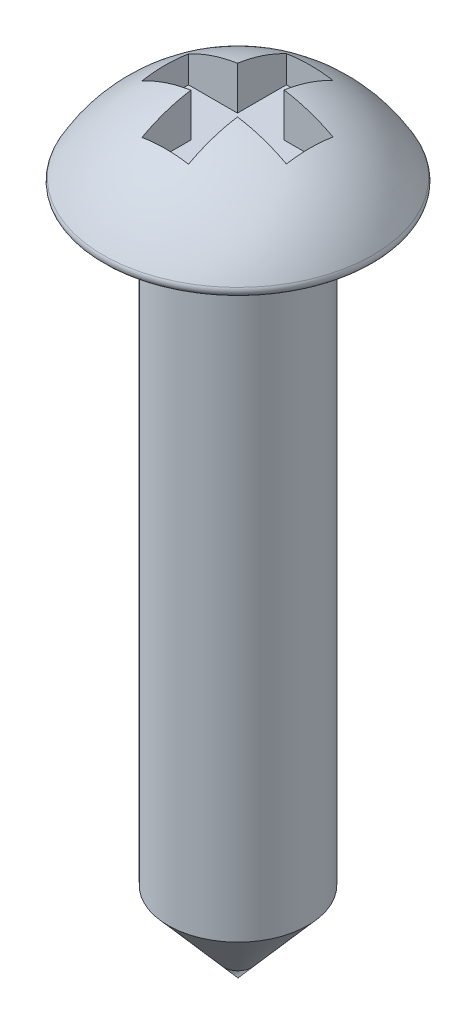
ISO-10303-21;
HEADER;
FILE_DESCRIPTION(('STEP AP214'),'2;1');
FILE_NAME('part.step','',(''),(''),'','','');
FILE_SCHEMA(('AUTOMOTIVE_DESIGN { 1 0 10303 214 1 1 1 1 }'));
ENDSEC;
DATA;
#1=APPLICATION_CONTEXT('core data for automotive mechanical design processes');
#2=APPLICATION_PROTOCOL_DEFINITION('international standard','automotive_design',2000,#1);
#3=PRODUCT_CONTEXT('',#1,'mechanical');
#4=PRODUCT('Part','Part','',(#3));
#5=PRODUCT_RELATED_PRODUCT_CATEGORY('part','',(#4));
#6=PRODUCT_DEFINITION_FORMATION('','',#4);
#7=PRODUCT_DEFINITION_CONTEXT('part definition',#1,'design');
#8=PRODUCT_DEFINITION('design','',#6,#7);
#9=PRODUCT_DEFINITION_SHAPE('','',#8);
#10=(LENGTH_UNIT() NAMED_UNIT(*) SI_UNIT(.MILLI.,.METRE.));
#11=(NAMED_UNIT(*) PLANE_ANGLE_UNIT() SI_UNIT($,.RADIAN.));
#12=(NAMED_UNIT(*) SI_UNIT($,.STERADIAN.) SOLID_ANGLE_UNIT());
#13=UNCERTAINTY_MEASURE_WITH_UNIT(LENGTH_MEASURE(1.E-05),#10,'distance_accuracy_value','');
#14=(GEOMETRIC_REPRESENTATION_CONTEXT(3) GLOBAL_UNCERTAINTY_ASSIGNED_CONTEXT((#13)) GLOBAL_UNIT_ASSIGNED_CONTEXT((#10,
#11,#12)) REPRESENTATION_CONTEXT('',''));
#15=CARTESIAN_POINT('',(0.,0.,0.));
#16=DIRECTION('',(0.,0.,1.));
#17=DIRECTION('',(1.,0.,0.));
#18=AXIS2_PLACEMENT_3D('',#15,#16,#17);
#19=CARTESIAN_POINT('',(0.,-10.7655291922982,0.));
#20=DIRECTION('',(0.,1.,0.));
#21=DIRECTION('',(-1.,0.,0.));
#22=AXIS2_PLACEMENT_3D('',#19,#20,#21);
#23=CONICAL_SURFACE('',#22,0.,0.715536498461953);
#24=CARTESIAN_POINT('',(0.,-9.5,0.));
#25=DIRECTION('',(0.,1.,0.));
#26=DIRECTION('',(-1.,0.,0.));
#27=AXIS2_PLACEMENT_3D('',#24,#25,#26);
#28=CIRCLE('',#27,1.1);
#29=CARTESIAN_POINT('',(-1.1,-9.5,0.));
#30=VERTEX_POINT('',#29);
#31=EDGE_CURVE('E201',#30,#30,#28,.T.);
#32=ORIENTED_EDGE('',*,*,#31,.F.);
#33=EDGE_LOOP('',(#32));
#34=FACE_BOUND('',#33,.T.);
#35=CARTESIAN_POINT('',(0.,-10.7655291922982,0.));
#36=VERTEX_POINT('',#35);
#37=VERTEX_LOOP('',#36);
#38=FACE_BOUND('',#37,.T.);
#39=ADVANCED_FACE('F32',(#34,#38),#23,.T.);
#40=CARTESIAN_POINT('',(0.,3.8000547936802,0.));
#41=DIRECTION('',(0.,1.,0.));
#42=DIRECTION('',(-1.,0.,0.));
#43=AXIS2_PLACEMENT_3D('',#40,#41,#42);
#44=CYLINDRICAL_SURFACE('',#43,1.1);
#45=CARTESIAN_POINT('',(0.,0.,0.));
#46=DIRECTION('',(0.,1.,0.));
#47=DIRECTION('',(-1.,0.,0.));
#48=AXIS2_PLACEMENT_3D('',#45,#46,#47);
#49=CIRCLE('',#48,1.1);
#50=CARTESIAN_POINT('',(-1.1,0.,0.));
#51=VERTEX_POINT('',#50);
#52=EDGE_CURVE('E170',#51,#51,#49,.T.);
#53=ORIENTED_EDGE('',*,*,#52,.F.);
#54=EDGE_LOOP('',(#53));
#55=FACE_BOUND('',#54,.T.);
#56=ORIENTED_EDGE('',*,*,#31,.T.);
#57=EDGE_LOOP('',(#56));
#58=FACE_BOUND('',#57,.T.);
#59=ADVANCED_FACE('F279',(#55,#58),#44,.T.);
#60=CARTESIAN_POINT('',(2.2,0.,0.));
#61=DIRECTION('',(0.,1.,0.));
#62=DIRECTION('',(-1.,0.,0.));
#63=AXIS2_PLACEMENT_3D('',#60,#61,#62);
#64=PLANE('',#63);
#65=CARTESIAN_POINT('',(0.,0.,0.));
#66=DIRECTION('',(0.,1.,0.));
#67=DIRECTION('',(-1.,0.,0.));
#68=AXIS2_PLACEMENT_3D('',#65,#66,#67);
#69=CIRCLE('',#68,2.0359463499672);
#70=CARTESIAN_POINT('',(-2.0359463499672,0.,0.));
#71=VERTEX_POINT('',#70);
#72=EDGE_CURVE('E207',#71,#71,#69,.F.);
#73=ORIENTED_EDGE('',*,*,#72,.T.);
#74=EDGE_LOOP('',(#73));
#75=FACE_BOUND('',#74,.T.);
#76=ORIENTED_EDGE('',*,*,#52,.T.);
#77=EDGE_LOOP('',(#76));
#78=FACE_BOUND('',#77,.T.);
#79=ADVANCED_FACE('F284',(#75,#78),#64,.F.);
#80=CARTESIAN_POINT('',(0.,-1.04082556730939,0.));
#81=DIRECTION('',(0.,1.,0.));
#82=DIRECTION('',(1.,0.,0.));
#83=AXIS2_PLACEMENT_3D('',#80,#81,#82);
#84=SPHERICAL_SURFACE('',#83,2.43378673296674);
#85=CARTESIAN_POINT('',(0.,-1.04082556730939,0.370388630185053));
#86=DIRECTION('',(0.,0.,1.));
#87=DIRECTION('',(1.,0.,0.));
#88=AXIS2_PLACEMENT_3D('',#85,#86,#87);
#89=CIRCLE('',#88,2.40543761594321);
#90=CARTESIAN_POINT('',(1.13232028828451,1.08143287334618,0.370388630185053));
#91=VERTEX_POINT('',#90);
#92=CARTESIAN_POINT('',(0.361948002760647,1.33722484584255,0.370388630185053));
#93=VERTEX_POINT('',#92);
#94=EDGE_CURVE('E210',#91,#93,#89,.T.);
#95=ORIENTED_EDGE('',*,*,#94,.T.);
#96=CARTESIAN_POINT('',(0.361948002760647,-1.04082556730939,0.));
#97=DIRECTION('',(1.,0.,0.));
#98=DIRECTION('',(0.,0.,-1.));
#99=AXIS2_PLACEMENT_3D('',#96,#97,#98);
#100=CIRCLE('',#99,2.40672214949348);
#101=CARTESIAN_POINT('',(0.361948002760647,1.07836674063565,1.14076091570892));
#102=VERTEX_POINT('',#101);
#103=EDGE_CURVE('E11',#93,#102,#100,.T.);
#104=ORIENTED_EDGE('',*,*,#103,.T.);
#105=CARTESIAN_POINT('',(0.,-1.04082556730939,1.14076091570892));
#106=DIRECTION('',(0.,0.,1.));
#107=DIRECTION('',(1.,0.,0.));
#108=AXIS2_PLACEMENT_3D('',#105,#106,#107);
#109=CIRCLE('',#108,2.14987962331752);
#110=CARTESIAN_POINT('',(-0.371599949500931,1.07669559487218,1.14076091570892));
#111=VERTEX_POINT('',#110);
#112=EDGE_CURVE('E40',#102,#111,#109,.T.);
#113=ORIENTED_EDGE('',*,*,#112,.T.);
#114=CARTESIAN_POINT('',(-0.371599949500931,-1.04082556730939,0.));
#115=DIRECTION('',(-1.,0.,0.));
#116=DIRECTION('',(0.,0.,1.));
#117=AXIS2_PLACEMENT_3D('',#114,#115,#116);
#118=CIRCLE('',#117,2.40525078507332);
#119=CARTESIAN_POINT('',(-0.371599949500931,1.3357357303906,0.370388630185053));
#120=VERTEX_POINT('',#119);
#121=EDGE_CURVE('E236',#111,#120,#118,.T.);
#122=ORIENTED_EDGE('',*,*,#121,.T.);
#123=CARTESIAN_POINT('',(0.,-1.04082556730939,0.370388630185053));
#124=DIRECTION('',(0.,0.,1.));
#125=DIRECTION('',(1.,0.,0.));
#126=AXIS2_PLACEMENT_3D('',#123,#124,#125);
#127=CIRCLE('',#126,2.40543761594321);
#128=CARTESIAN_POINT('',(-1.14197223502479,1.07625486069211,0.370388630185054));
#129=VERTEX_POINT('',#128);
#130=EDGE_CURVE('E233',#120,#129,#127,.T.);
#131=ORIENTED_EDGE('',*,*,#130,.T.);
#132=CARTESIAN_POINT('',(-1.14197223502479,-1.04082556730939,0.));
#133=DIRECTION('',(-1.,0.,0.));
#134=DIRECTION('',(0.,0.,1.));
#135=AXIS2_PLACEMENT_3D('',#132,#133,#134);
#136=CIRCLE('',#135,2.14923644022648);
#137=CARTESIAN_POINT('',(-1.14197223502479,1.07750693321698,-0.363159322076525));
#138=VERTEX_POINT('',#137);
#139=EDGE_CURVE('E230',#129,#138,#136,.T.);
#140=ORIENTED_EDGE('',*,*,#139,.T.);
#141=CARTESIAN_POINT('',(0.,-1.04082556730939,-0.363159322076525));
#142=DIRECTION('',(0.,0.,-1.));
#143=DIRECTION('',(-1.,0.,0.));
#144=AXIS2_PLACEMENT_3D('',#141,#142,#143);
#145=CIRCLE('',#144,2.40653966689806);
#146=CARTESIAN_POINT('',(-0.371599949500931,1.33685116552978,-0.363159322076525));
#147=VERTEX_POINT('',#146);
#148=EDGE_CURVE('E227',#138,#147,#145,.T.);
#149=ORIENTED_EDGE('',*,*,#148,.T.);
#150=CARTESIAN_POINT('',(-0.371599949500931,-1.04082556730939,0.));
#151=DIRECTION('',(-1.,0.,0.));
#152=DIRECTION('',(0.,0.,1.));
#153=AXIS2_PLACEMENT_3D('',#150,#151,#152);
#154=CIRCLE('',#153,2.40525078507332);
#155=CARTESIAN_POINT('',(-0.371599949500931,1.08057430863731,-1.13353160760039));
#156=VERTEX_POINT('',#155);
#157=EDGE_CURVE('E224',#147,#156,#154,.T.);
#158=ORIENTED_EDGE('',*,*,#157,.T.);
#159=CARTESIAN_POINT('',(0.,-1.04082556730939,-1.13353160760039));
#160=DIRECTION('',(0.,0.,-1.));
#161=DIRECTION('',(-1.,0.,0.));
#162=AXIS2_PLACEMENT_3D('',#159,#160,#161);
#163=CIRCLE('',#162,2.15370006178572);
#164=CARTESIAN_POINT('',(0.361948002760647,1.08224240132312,-1.13353160760039));
#165=VERTEX_POINT('',#164);
#166=EDGE_CURVE('E221',#156,#165,#163,.T.);
#167=ORIENTED_EDGE('',*,*,#166,.T.);
#168=CARTESIAN_POINT('',(0.361948002760647,-1.04082556730939,0.));
#169=DIRECTION('',(1.,0.,0.));
#170=DIRECTION('',(0.,0.,-1.));
#171=AXIS2_PLACEMENT_3D('',#168,#169,#170);
#172=CIRCLE('',#171,2.40672214949348);
#173=CARTESIAN_POINT('',(0.361948002760647,1.33833958283286,-0.363159322076525));
#174=VERTEX_POINT('',#173);
#175=EDGE_CURVE('E218',#165,#174,#172,.T.);
#176=ORIENTED_EDGE('',*,*,#175,.T.);
#177=CARTESIAN_POINT('',(0.,-1.04082556730939,-0.363159322076525));
#178=DIRECTION('',(0.,0.,-1.));
#179=DIRECTION('',(-1.,0.,0.));
#180=AXIS2_PLACEMENT_3D('',#177,#178,#179);
#181=CIRCLE('',#180,2.40653966689806);
#182=CARTESIAN_POINT('',(1.13232028828451,1.0826818927889,-0.363159322076525));
#183=VERTEX_POINT('',#182);
#184=EDGE_CURVE('E215',#174,#183,#181,.T.);
#185=ORIENTED_EDGE('',*,*,#184,.T.);
#186=CARTESIAN_POINT('',(1.13232028828451,-1.04082556730939,0.));
#187=DIRECTION('',(1.,0.,0.));
#188=DIRECTION('',(0.,0.,-1.));
#189=AXIS2_PLACEMENT_3D('',#186,#187,#188);
#190=CIRCLE('',#189,2.15433716634704);
#191=EDGE_CURVE('E212',#183,#91,#190,.T.);
#192=ORIENTED_EDGE('',*,*,#191,.T.);
#193=EDGE_LOOP('',(#95,#104,#113,#122,#131,#140,#149,#158,#167,#176,#185,#192));
#194=FACE_BOUND('',#193,.T.);
#195=CARTESIAN_POINT('',(0.,0.148883025650726,0.));
#196=DIRECTION('',(0.,-1.,0.));
#197=DIRECTION('',(1.,0.,0.));
#198=AXIS2_PLACEMENT_3D('',#195,#196,#197);
#199=CIRCLE('',#198,2.12318424198226);
#200=CARTESIAN_POINT('',(2.12318424198226,0.148883025650726,0.));
#201=VERTEX_POINT('',#200);
#202=EDGE_CURVE('E204',#201,#201,#199,.F.);
#203=ORIENTED_EDGE('',*,*,#202,.T.);
#204=EDGE_LOOP('',(#203));
#205=FACE_BOUND('',#204,.T.);
#206=ADVANCED_FACE('F240',(#194,#205),#84,.T.);
#207=CARTESIAN_POINT('',(0.,0.0999999999999996,0.));
#208=DIRECTION('',(0.,1.,0.));
#209=DIRECTION('',(-1.,0.,0.));
#210=AXIS2_PLACEMENT_3D('',#207,#208,#209);
#211=TOROIDAL_SURFACE('',#210,2.0359463499672,0.1);
#212=ORIENTED_EDGE('',*,*,#72,.F.);
#213=EDGE_LOOP('',(#212));
#214=FACE_BOUND('',#213,.T.);
#215=ORIENTED_EDGE('',*,*,#202,.F.);
#216=EDGE_LOOP('',(#215));
#217=FACE_BOUND('',#216,.T.);
#218=ADVANCED_FACE('F34',(#214,#217),#211,.T.);
#219=CARTESIAN_POINT('',(0.361948002760647,0.656537419888082,1.14076091570892));
#220=DIRECTION('',(1.,0.,0.));
#221=DIRECTION('',(0.,0.,-1.));
#222=AXIS2_PLACEMENT_3D('',#219,#220,#221);
#223=PLANE('',#222);
#224=DIRECTION('',(0.,1.,0.));
#225=VECTOR('',#224,1.);
#226=CARTESIAN_POINT('',(0.361948002760647,0.656537419888082,0.370388630185053));
#227=LINE('',#226,#225);
#228=CARTESIAN_POINT('',(0.361948002760647,0.656537419888082,0.370388630185053));
#229=VERTEX_POINT('',#228);
#230=EDGE_CURVE('E47',#229,#93,#227,.T.);
#231=ORIENTED_EDGE('',*,*,#230,.F.);
#232=DIRECTION('',(0.,0.,-1.));
#233=VECTOR('',#232,1.);
#234=CARTESIAN_POINT('',(0.361948002760647,0.656537419888082,1.14076091570892));
#235=LINE('',#234,#233);
#236=CARTESIAN_POINT('',(0.361948002760647,0.656537419888082,1.14076091570892));
#237=VERTEX_POINT('',#236);
#238=EDGE_CURVE('E123',#237,#229,#235,.T.);
#239=ORIENTED_EDGE('',*,*,#238,.F.);
#240=DIRECTION('',(0.,1.,0.));
#241=VECTOR('',#240,1.);
#242=CARTESIAN_POINT('',(0.361948002760647,0.656537419888082,1.14076091570892));
#243=LINE('',#242,#241);
#244=EDGE_CURVE('E168',#237,#102,#243,.T.);
#245=ORIENTED_EDGE('',*,*,#244,.T.);
#246=ORIENTED_EDGE('',*,*,#103,.F.);
#247=EDGE_LOOP('',(#231,#239,#245,#246));
#248=FACE_BOUND('',#247,.T.);
#249=ADVANCED_FACE('F120',(#248),#223,.F.);
#250=CARTESIAN_POINT('',(0.361948002760647,0.656537419888082,1.14076091570892));
#251=DIRECTION('',(0.,0.,1.));
#252=DIRECTION('',(1.,0.,0.));
#253=AXIS2_PLACEMENT_3D('',#250,#251,#252);
#254=PLANE('',#253);
#255=ORIENTED_EDGE('',*,*,#244,.F.);
#256=DIRECTION('',(1.,0.,0.));
#257=VECTOR('',#256,1.);
#258=CARTESIAN_POINT('',(0.361948002760647,0.656537419888082,1.14076091570892));
#259=LINE('',#258,#257);
#260=CARTESIAN_POINT('',(-0.371599949500931,0.656537419888082,1.14076091570892));
#261=VERTEX_POINT('',#260);
#262=EDGE_CURVE('E127',#261,#237,#259,.T.);
#263=ORIENTED_EDGE('',*,*,#262,.F.);
#264=DIRECTION('',(0.,1.,0.));
#265=VECTOR('',#264,1.);
#266=CARTESIAN_POINT('',(-0.371599949500931,0.656537419888082,1.14076091570892));
#267=LINE('',#266,#265);
#268=EDGE_CURVE('E171',#261,#111,#267,.T.);
#269=ORIENTED_EDGE('',*,*,#268,.T.);
#270=ORIENTED_EDGE('',*,*,#112,.F.);
#271=EDGE_LOOP('',(#255,#263,#269,#270));
#272=FACE_BOUND('',#271,.T.);
#273=ADVANCED_FACE('F243',(#272),#254,.F.);
#274=CARTESIAN_POINT('',(-0.371599949500931,0.656537419888082,1.14076091570892));
#275=DIRECTION('',(-1.,0.,0.));
#276=DIRECTION('',(0.,0.,1.));
#277=AXIS2_PLACEMENT_3D('',#274,#275,#276);
#278=PLANE('',#277);
#279=ORIENTED_EDGE('',*,*,#268,.F.);
#280=DIRECTION('',(0.,0.,1.));
#281=VECTOR('',#280,1.);
#282=CARTESIAN_POINT('',(-0.371599949500931,0.656537419888082,1.14076091570892));
#283=LINE('',#282,#281);
#284=CARTESIAN_POINT('',(-0.371599949500931,0.656537419888082,0.370388630185053));
#285=VERTEX_POINT('',#284);
#286=EDGE_CURVE('E165',#285,#261,#283,.T.);
#287=ORIENTED_EDGE('',*,*,#286,.F.);
#288=DIRECTION('',(0.,1.,0.));
#289=VECTOR('',#288,1.);
#290=CARTESIAN_POINT('',(-0.371599949500931,0.656537419888082,0.370388630185053));
#291=LINE('',#290,#289);
#292=EDGE_CURVE('E174',#285,#120,#291,.T.);
#293=ORIENTED_EDGE('',*,*,#292,.T.);
#294=ORIENTED_EDGE('',*,*,#121,.F.);
#295=EDGE_LOOP('',(#279,#287,#293,#294));
#296=FACE_BOUND('',#295,.T.);
#297=ADVANCED_FACE('F246',(#296),#278,.F.);
#298=CARTESIAN_POINT('',(-0.371599949500931,0.656537419888082,0.370388630185053));
#299=DIRECTION('',(0.,0.,1.));
#300=DIRECTION('',(1.,0.,0.));
#301=AXIS2_PLACEMENT_3D('',#298,#299,#300);
#302=PLANE('',#301);
#303=ORIENTED_EDGE('',*,*,#292,.F.);
#304=DIRECTION('',(1.,0.,0.));
#305=VECTOR('',#304,1.);
#306=CARTESIAN_POINT('',(-0.371599949500931,0.656537419888082,0.370388630185053));
#307=LINE('',#306,#305);
#308=CARTESIAN_POINT('',(-1.14197223502479,0.656537419888082,0.370388630185054));
#309=VERTEX_POINT('',#308);
#310=EDGE_CURVE('E162',#309,#285,#307,.T.);
#311=ORIENTED_EDGE('',*,*,#310,.F.);
#312=DIRECTION('',(0.,1.,0.));
#313=VECTOR('',#312,1.);
#314=CARTESIAN_POINT('',(-1.14197223502479,0.656537419888082,0.370388630185054));
#315=LINE('',#314,#313);
#316=EDGE_CURVE('E177',#309,#129,#315,.T.);
#317=ORIENTED_EDGE('',*,*,#316,.T.);
#318=ORIENTED_EDGE('',*,*,#130,.F.);
#319=EDGE_LOOP('',(#303,#311,#317,#318));
#320=FACE_BOUND('',#319,.T.);
#321=ADVANCED_FACE('F250',(#320),#302,.F.);
#322=CARTESIAN_POINT('',(-1.14197223502479,0.656537419888082,0.370388630185054));
#323=DIRECTION('',(-1.,0.,0.));
#324=DIRECTION('',(0.,0.,1.));
#325=AXIS2_PLACEMENT_3D('',#322,#323,#324);
#326=PLANE('',#325);
#327=ORIENTED_EDGE('',*,*,#316,.F.);
#328=DIRECTION('',(0.,0.,1.));
#329=VECTOR('',#328,1.);
#330=CARTESIAN_POINT('',(-1.14197223502479,0.656537419888082,0.370388630185054));
#331=LINE('',#330,#329);
#332=CARTESIAN_POINT('',(-1.14197223502479,0.656537419888082,-0.363159322076525));
#333=VERTEX_POINT('',#332);
#334=EDGE_CURVE('E159',#333,#309,#331,.T.);
#335=ORIENTED_EDGE('',*,*,#334,.F.);
#336=DIRECTION('',(0.,1.,0.));
#337=VECTOR('',#336,1.);
#338=CARTESIAN_POINT('',(-1.14197223502479,0.656537419888082,-0.363159322076525));
#339=LINE('',#338,#337);
#340=EDGE_CURVE('E180',#333,#138,#339,.T.);
#341=ORIENTED_EDGE('',*,*,#340,.T.);
#342=ORIENTED_EDGE('',*,*,#139,.F.);
#343=EDGE_LOOP('',(#327,#335,#341,#342));
#344=FACE_BOUND('',#343,.T.);
#345=ADVANCED_FACE('F252',(#344),#326,.F.);
#346=CARTESIAN_POINT('',(-0.371599949500931,0.656537419888082,-0.363159322076525));
#347=DIRECTION('',(0.,0.,-1.));
#348=DIRECTION('',(-1.,0.,0.));
#349=AXIS2_PLACEMENT_3D('',#346,#347,#348);
#350=PLANE('',#349);
#351=ORIENTED_EDGE('',*,*,#340,.F.);
#352=DIRECTION('',(-1.,0.,0.));
#353=VECTOR('',#352,1.);
#354=CARTESIAN_POINT('',(-0.371599949500931,0.656537419888082,-0.363159322076525));
#355=LINE('',#354,#353);
#356=CARTESIAN_POINT('',(-0.371599949500931,0.656537419888082,-0.363159322076525));
#357=VERTEX_POINT('',#356);
#358=EDGE_CURVE('E156',#357,#333,#355,.T.);
#359=ORIENTED_EDGE('',*,*,#358,.F.);
#360=DIRECTION('',(0.,1.,0.));
#361=VECTOR('',#360,1.);
#362=CARTESIAN_POINT('',(-0.371599949500931,0.656537419888082,-0.363159322076525));
#363=LINE('',#362,#361);
#364=EDGE_CURVE('E183',#357,#147,#363,.T.);
#365=ORIENTED_EDGE('',*,*,#364,.T.);
#366=ORIENTED_EDGE('',*,*,#148,.F.);
#367=EDGE_LOOP('',(#351,#359,#365,#366));
#368=FACE_BOUND('',#367,.T.);
#369=ADVANCED_FACE('F255',(#368),#350,.F.);
#370=CARTESIAN_POINT('',(-0.371599949500931,0.656537419888082,-0.363159322076525));
#371=DIRECTION('',(-1.,0.,0.));
#372=DIRECTION('',(0.,0.,1.));
#373=AXIS2_PLACEMENT_3D('',#370,#371,#372);
#374=PLANE('',#373);
#375=ORIENTED_EDGE('',*,*,#364,.F.);
#376=DIRECTION('',(0.,0.,1.));
#377=VECTOR('',#376,1.);
#378=CARTESIAN_POINT('',(-0.371599949500931,0.656537419888082,-0.363159322076525));
#379=LINE('',#378,#377);
#380=CARTESIAN_POINT('',(-0.371599949500931,0.656537419888082,-1.13353160760039));
#381=VERTEX_POINT('',#380);
#382=EDGE_CURVE('E153',#381,#357,#379,.T.);
#383=ORIENTED_EDGE('',*,*,#382,.F.);
#384=DIRECTION('',(0.,1.,0.));
#385=VECTOR('',#384,1.);
#386=CARTESIAN_POINT('',(-0.371599949500931,0.656537419888082,-1.13353160760039));
#387=LINE('',#386,#385);
#388=EDGE_CURVE('E186',#381,#156,#387,.T.);
#389=ORIENTED_EDGE('',*,*,#388,.T.);
#390=ORIENTED_EDGE('',*,*,#157,.F.);
#391=EDGE_LOOP('',(#375,#383,#389,#390));
#392=FACE_BOUND('',#391,.T.);
#393=ADVANCED_FACE('F258',(#392),#374,.F.);
#394=CARTESIAN_POINT('',(0.361948002760647,0.656537419888082,-1.13353160760039));
#395=DIRECTION('',(0.,0.,-1.));
#396=DIRECTION('',(-1.,0.,0.));
#397=AXIS2_PLACEMENT_3D('',#394,#395,#396);
#398=PLANE('',#397);
#399=ORIENTED_EDGE('',*,*,#388,.F.);
#400=DIRECTION('',(-1.,0.,0.));
#401=VECTOR('',#400,1.);
#402=CARTESIAN_POINT('',(0.361948002760647,0.656537419888082,-1.13353160760039));
#403=LINE('',#402,#401);
#404=CARTESIAN_POINT('',(0.361948002760647,0.656537419888082,-1.13353160760039));
#405=VERTEX_POINT('',#404);
#406=EDGE_CURVE('E150',#405,#381,#403,.T.);
#407=ORIENTED_EDGE('',*,*,#406,.F.);
#408=DIRECTION('',(0.,1.,0.));
#409=VECTOR('',#408,1.);
#410=CARTESIAN_POINT('',(0.361948002760647,0.656537419888082,-1.13353160760039));
#411=LINE('',#410,#409);
#412=EDGE_CURVE('E189',#405,#165,#411,.T.);
#413=ORIENTED_EDGE('',*,*,#412,.T.);
#414=ORIENTED_EDGE('',*,*,#166,.F.);
#415=EDGE_LOOP('',(#399,#407,#413,#414));
#416=FACE_BOUND('',#415,.T.);
#417=ADVANCED_FACE('F260',(#416),#398,.F.);
#418=CARTESIAN_POINT('',(0.361948002760647,0.656537419888082,-0.363159322076525));
#419=DIRECTION('',(1.,0.,0.));
#420=DIRECTION('',(0.,0.,-1.));
#421=AXIS2_PLACEMENT_3D('',#418,#419,#420);
#422=PLANE('',#421);
#423=ORIENTED_EDGE('',*,*,#412,.F.);
#424=DIRECTION('',(0.,0.,-1.));
#425=VECTOR('',#424,1.);
#426=CARTESIAN_POINT('',(0.361948002760647,0.656537419888082,-0.363159322076525));
#427=LINE('',#426,#425);
#428=CARTESIAN_POINT('',(0.361948002760647,0.656537419888082,-0.363159322076525));
#429=VERTEX_POINT('',#428);
#430=EDGE_CURVE('E147',#429,#405,#427,.T.);
#431=ORIENTED_EDGE('',*,*,#430,.F.);
#432=DIRECTION('',(0.,1.,0.));
#433=VECTOR('',#432,1.);
#434=CARTESIAN_POINT('',(0.361948002760647,0.656537419888082,-0.363159322076525));
#435=LINE('',#434,#433);
#436=EDGE_CURVE('E192',#429,#174,#435,.T.);
#437=ORIENTED_EDGE('',*,*,#436,.T.);
#438=ORIENTED_EDGE('',*,*,#175,.F.);
#439=EDGE_LOOP('',(#423,#431,#437,#438));
#440=FACE_BOUND('',#439,.T.);
#441=ADVANCED_FACE('F264',(#440),#422,.F.);
#442=CARTESIAN_POINT('',(1.13232028828451,0.656537419888082,-0.363159322076525));
#443=DIRECTION('',(0.,0.,-1.));
#444=DIRECTION('',(-1.,0.,0.));
#445=AXIS2_PLACEMENT_3D('',#442,#443,#444);
#446=PLANE('',#445);
#447=ORIENTED_EDGE('',*,*,#436,.F.);
#448=DIRECTION('',(-1.,0.,0.));
#449=VECTOR('',#448,1.);
#450=CARTESIAN_POINT('',(1.13232028828451,0.656537419888082,-0.363159322076525));
#451=LINE('',#450,#449);
#452=CARTESIAN_POINT('',(1.13232028828451,0.656537419888082,-0.363159322076525));
#453=VERTEX_POINT('',#452);
#454=EDGE_CURVE('E144',#453,#429,#451,.T.);
#455=ORIENTED_EDGE('',*,*,#454,.F.);
#456=DIRECTION('',(0.,1.,0.));
#457=VECTOR('',#456,1.);
#458=CARTESIAN_POINT('',(1.13232028828451,0.656537419888082,-0.363159322076525));
#459=LINE('',#458,#457);
#460=EDGE_CURVE('E195',#453,#183,#459,.T.);
#461=ORIENTED_EDGE('',*,*,#460,.T.);
#462=ORIENTED_EDGE('',*,*,#184,.F.);
#463=EDGE_LOOP('',(#447,#455,#461,#462));
#464=FACE_BOUND('',#463,.T.);
#465=ADVANCED_FACE('F267',(#464),#446,.F.);
#466=CARTESIAN_POINT('',(1.13232028828451,0.656537419888082,0.370388630185053));
#467=DIRECTION('',(1.,0.,0.));
#468=DIRECTION('',(0.,0.,-1.));
#469=AXIS2_PLACEMENT_3D('',#466,#467,#468);
#470=PLANE('',#469);
#471=ORIENTED_EDGE('',*,*,#460,.F.);
#472=DIRECTION('',(0.,0.,-1.));
#473=VECTOR('',#472,1.);
#474=CARTESIAN_POINT('',(1.13232028828451,0.656537419888082,0.370388630185053));
#475=LINE('',#474,#473);
#476=CARTESIAN_POINT('',(1.13232028828451,0.656537419888082,0.370388630185053));
#477=VERTEX_POINT('',#476);
#478=EDGE_CURVE('E136',#477,#453,#475,.T.);
#479=ORIENTED_EDGE('',*,*,#478,.F.);
#480=DIRECTION('',(0.,1.,0.));
#481=VECTOR('',#480,1.);
#482=CARTESIAN_POINT('',(1.13232028828451,0.656537419888082,0.370388630185053));
#483=LINE('',#482,#481);
#484=EDGE_CURVE('E126',#477,#91,#483,.T.);
#485=ORIENTED_EDGE('',*,*,#484,.T.);
#486=ORIENTED_EDGE('',*,*,#191,.F.);
#487=EDGE_LOOP('',(#471,#479,#485,#486));
#488=FACE_BOUND('',#487,.T.);
#489=ADVANCED_FACE('F269',(#488),#470,.F.);
#490=CARTESIAN_POINT('',(1.13232028828451,0.656537419888082,0.370388630185053));
#491=DIRECTION('',(0.,0.,1.));
#492=DIRECTION('',(1.,0.,0.));
#493=AXIS2_PLACEMENT_3D('',#490,#491,#492);
#494=PLANE('',#493);
#495=ORIENTED_EDGE('',*,*,#484,.F.);
#496=DIRECTION('',(1.,0.,0.));
#497=VECTOR('',#496,1.);
#498=CARTESIAN_POINT('',(1.13232028828451,0.656537419888082,0.370388630185053));
#499=LINE('',#498,#497);
#500=EDGE_CURVE('E130',#229,#477,#499,.T.);
#501=ORIENTED_EDGE('',*,*,#500,.F.);
#502=ORIENTED_EDGE('',*,*,#230,.T.);
#503=ORIENTED_EDGE('',*,*,#94,.F.);
#504=EDGE_LOOP('',(#495,#501,#502,#503));
#505=FACE_BOUND('',#504,.T.);
#506=ADVANCED_FACE('F131',(#505),#494,.F.);
#507=CARTESIAN_POINT('',(0.361948002760647,0.656537419888082,-1.13353160760039));
#508=DIRECTION('',(0.,1.,0.));
#509=DIRECTION('',(0.,0.,1.));
#510=AXIS2_PLACEMENT_3D('',#507,#508,#509);
#511=PLANE('',#510);
#512=ORIENTED_EDGE('',*,*,#238,.T.);
#513=ORIENTED_EDGE('',*,*,#500,.T.);
#514=ORIENTED_EDGE('',*,*,#478,.T.);
#515=ORIENTED_EDGE('',*,*,#454,.T.);
#516=ORIENTED_EDGE('',*,*,#430,.T.);
#517=ORIENTED_EDGE('',*,*,#406,.T.);
#518=ORIENTED_EDGE('',*,*,#382,.T.);
#519=ORIENTED_EDGE('',*,*,#358,.T.);
#520=ORIENTED_EDGE('',*,*,#334,.T.);
#521=ORIENTED_EDGE('',*,*,#310,.T.);
#522=ORIENTED_EDGE('',*,*,#286,.T.);
#523=ORIENTED_EDGE('',*,*,#262,.T.);
#524=EDGE_LOOP('',(#512,#513,#514,#515,#516,#517,#518,#519,#520,#521,#522,#523));
#525=FACE_BOUND('',#524,.T.);
#526=ADVANCED_FACE('F138',(#525),#511,.T.);
#527=CLOSED_SHELL('',(#39,#59,#79,#206,#218,#249,#273,#297,#321,#345,#369,#393,#417,#441,#465,
#489,#506,#526));
#528=MANIFOLD_SOLID_BREP('B2',#527);
#529=ADVANCED_BREP_SHAPE_REPRESENTATION('',(#18,#528),#14);
#530=SHAPE_DEFINITION_REPRESENTATION(#9,#529);
ENDSEC;
END-ISO-10303-21;
